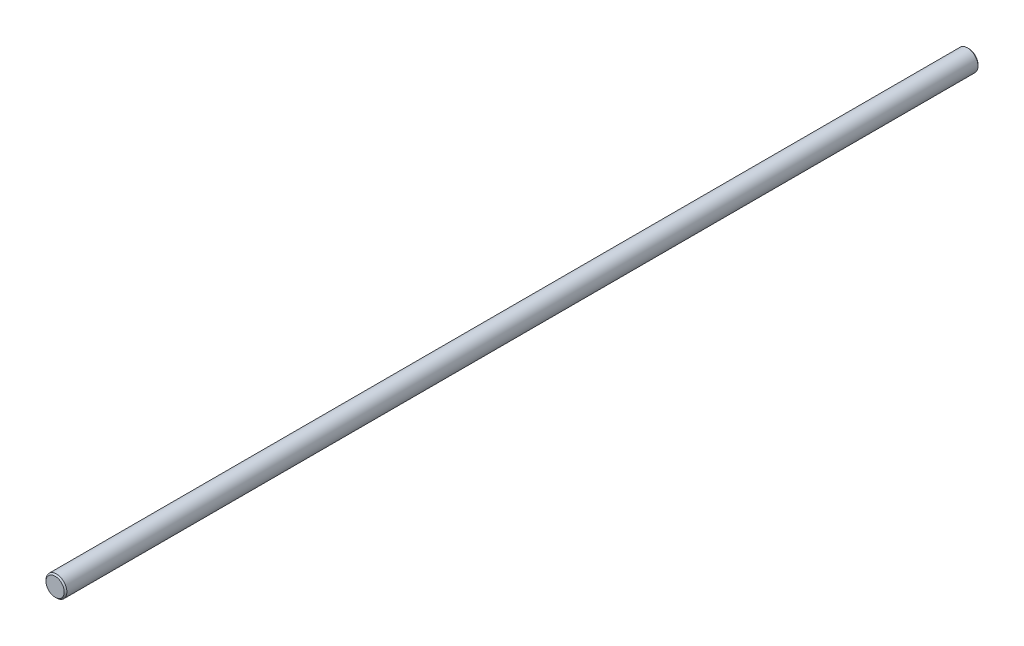
ISO-10303-21;
HEADER;
FILE_DESCRIPTION(('STEP AP214'),'2;1');
FILE_NAME('part.step','',(''),(''),'','','');
FILE_SCHEMA(('AUTOMOTIVE_DESIGN { 1 0 10303 214 1 1 1 1 }'));
ENDSEC;
DATA;
#1=APPLICATION_CONTEXT('core data for automotive mechanical design processes');
#2=APPLICATION_PROTOCOL_DEFINITION('international standard','automotive_design',2000,#1);
#3=PRODUCT_CONTEXT('',#1,'mechanical');
#4=PRODUCT('Part','Part','',(#3));
#5=PRODUCT_RELATED_PRODUCT_CATEGORY('part','',(#4));
#6=PRODUCT_DEFINITION_FORMATION('','',#4);
#7=PRODUCT_DEFINITION_CONTEXT('part definition',#1,'design');
#8=PRODUCT_DEFINITION('design','',#6,#7);
#9=PRODUCT_DEFINITION_SHAPE('','',#8);
#10=(LENGTH_UNIT() NAMED_UNIT(*) SI_UNIT(.MILLI.,.METRE.));
#11=(NAMED_UNIT(*) PLANE_ANGLE_UNIT() SI_UNIT($,.RADIAN.));
#12=(NAMED_UNIT(*) SI_UNIT($,.STERADIAN.) SOLID_ANGLE_UNIT());
#13=UNCERTAINTY_MEASURE_WITH_UNIT(LENGTH_MEASURE(1.E-05),#10,'distance_accuracy_value','');
#14=(GEOMETRIC_REPRESENTATION_CONTEXT(3) GLOBAL_UNCERTAINTY_ASSIGNED_CONTEXT((#13)) GLOBAL_UNIT_ASSIGNED_CONTEXT((#10,
#11,#12)) REPRESENTATION_CONTEXT('',''));
#15=CARTESIAN_POINT('',(0.,0.,0.));
#16=DIRECTION('',(0.,0.,1.));
#17=DIRECTION('',(1.,0.,0.));
#18=AXIS2_PLACEMENT_3D('',#15,#16,#17);
#19=CARTESIAN_POINT('',(0.,0.,175.));
#20=DIRECTION('',(0.,0.,-1.));
#21=DIRECTION('',(-1.,0.,0.));
#22=AXIS2_PLACEMENT_3D('',#19,#20,#21);
#23=CYLINDRICAL_SURFACE('',#22,4.);
#24=CARTESIAN_POINT('',(0.,0.,-174.5));
#25=DIRECTION('',(0.,0.,1.));
#26=DIRECTION('',(1.,0.,0.));
#27=AXIS2_PLACEMENT_3D('',#24,#25,#26);
#28=CIRCLE('',#27,4.);
#29=CARTESIAN_POINT('',(4.,0.,-174.5));
#30=VERTEX_POINT('',#29);
#31=EDGE_CURVE('E49',#30,#30,#28,.T.);
#32=ORIENTED_EDGE('',*,*,#31,.T.);
#33=EDGE_LOOP('',(#32));
#34=FACE_BOUND('',#33,.T.);
#35=CARTESIAN_POINT('',(0.,0.,174.5));
#36=DIRECTION('',(0.,0.,1.));
#37=DIRECTION('',(1.,0.,0.));
#38=AXIS2_PLACEMENT_3D('',#35,#36,#37);
#39=CIRCLE('',#38,4.);
#40=CARTESIAN_POINT('',(4.,0.,174.5));
#41=VERTEX_POINT('',#40);
#42=EDGE_CURVE('E53',#41,#41,#39,.F.);
#43=ORIENTED_EDGE('',*,*,#42,.T.);
#44=EDGE_LOOP('',(#43));
#45=FACE_BOUND('',#44,.T.);
#46=ADVANCED_FACE('F37',(#34,#45),#23,.T.);
#47=CARTESIAN_POINT('',(0.,0.,175.));
#48=DIRECTION('',(0.,0.,1.));
#49=DIRECTION('',(1.,0.,0.));
#50=AXIS2_PLACEMENT_3D('',#47,#48,#49);
#51=PLANE('',#50);
#52=CARTESIAN_POINT('',(0.,0.,175.));
#53=DIRECTION('',(0.,0.,1.));
#54=DIRECTION('',(1.,0.,0.));
#55=AXIS2_PLACEMENT_3D('',#52,#53,#54);
#56=CIRCLE('',#55,3.50000000000003);
#57=CARTESIAN_POINT('',(3.50000000000003,0.,175.));
#58=VERTEX_POINT('',#57);
#59=EDGE_CURVE('E10',#58,#58,#56,.T.);
#60=ORIENTED_EDGE('',*,*,#59,.T.);
#61=EDGE_LOOP('',(#60));
#62=FACE_BOUND('',#61,.T.);
#63=ADVANCED_FACE('F69',(#62),#51,.T.);
#64=CARTESIAN_POINT('',(0.,0.,-175.));
#65=DIRECTION('',(0.,0.,1.));
#66=DIRECTION('',(1.,0.,0.));
#67=AXIS2_PLACEMENT_3D('',#64,#65,#66);
#68=PLANE('',#67);
#69=CARTESIAN_POINT('',(0.,0.,-175.));
#70=DIRECTION('',(0.,0.,1.));
#71=DIRECTION('',(1.,0.,0.));
#72=AXIS2_PLACEMENT_3D('',#69,#70,#71);
#73=CIRCLE('',#72,3.49999999999998);
#74=CARTESIAN_POINT('',(3.49999999999998,0.,-175.));
#75=VERTEX_POINT('',#74);
#76=EDGE_CURVE('E45',#75,#75,#73,.F.);
#77=ORIENTED_EDGE('',*,*,#76,.T.);
#78=EDGE_LOOP('',(#77));
#79=FACE_BOUND('',#78,.T.);
#80=ADVANCED_FACE('F66',(#79),#68,.F.);
#81=CARTESIAN_POINT('',(0.,0.,-174.5));
#82=DIRECTION('',(0.,0.,1.));
#83=DIRECTION('',(1.,0.,0.));
#84=AXIS2_PLACEMENT_3D('',#81,#82,#83);
#85=CONICAL_SURFACE('',#84,4.,0.785398163397417);
#86=ORIENTED_EDGE('',*,*,#76,.F.);
#87=EDGE_LOOP('',(#86));
#88=FACE_BOUND('',#87,.T.);
#89=ORIENTED_EDGE('',*,*,#31,.F.);
#90=EDGE_LOOP('',(#89));
#91=FACE_BOUND('',#90,.T.);
#92=ADVANCED_FACE('F62',(#88,#91),#85,.T.);
#93=CARTESIAN_POINT('',(0.,0.,175.));
#94=DIRECTION('',(0.,0.,-1.));
#95=DIRECTION('',(-1.,0.,0.));
#96=AXIS2_PLACEMENT_3D('',#93,#94,#95);
#97=CONICAL_SURFACE('',#96,3.50000000000003,0.785398163397473);
#98=ORIENTED_EDGE('',*,*,#42,.F.);
#99=EDGE_LOOP('',(#98));
#100=FACE_BOUND('',#99,.T.);
#101=ORIENTED_EDGE('',*,*,#59,.F.);
#102=EDGE_LOOP('',(#101));
#103=FACE_BOUND('',#102,.T.);
#104=ADVANCED_FACE('F40',(#100,#103),#97,.T.);
#105=CLOSED_SHELL('',(#46,#63,#80,#92,#104));
#106=MANIFOLD_SOLID_BREP('B2',#105);
#107=ADVANCED_BREP_SHAPE_REPRESENTATION('',(#18,#106),#14);
#108=SHAPE_DEFINITION_REPRESENTATION(#9,#107);
ENDSEC;
END-ISO-10303-21;
